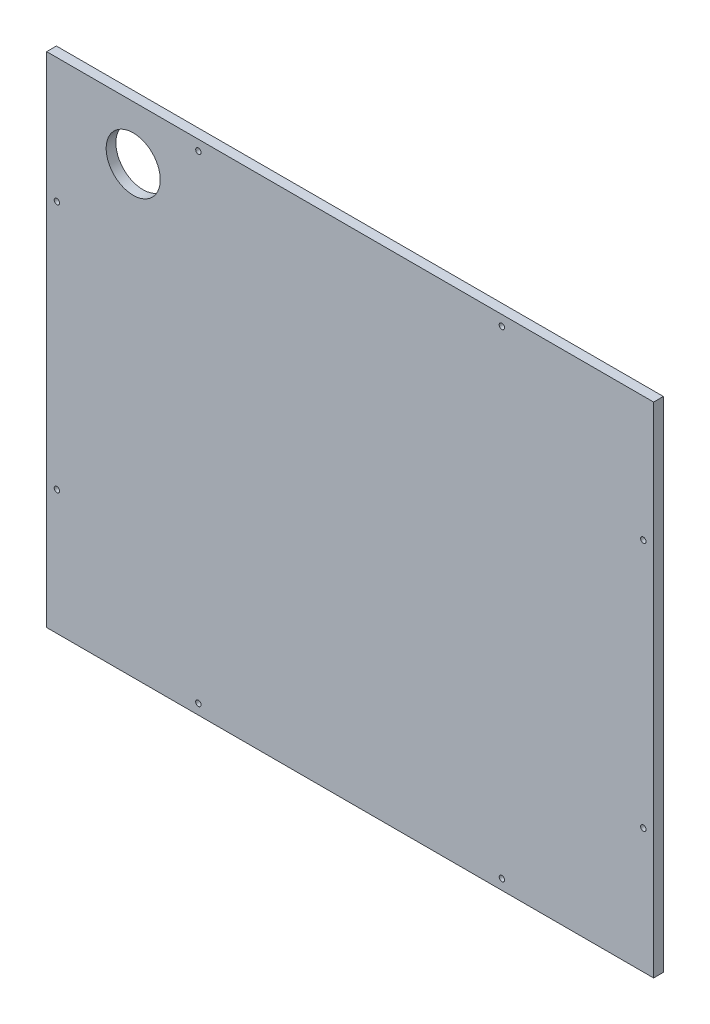
ISO-10303-21;
HEADER;
FILE_DESCRIPTION(('STEP AP214'),'2;1');
FILE_NAME('part.step','',(''),(''),'','','');
FILE_SCHEMA(('AUTOMOTIVE_DESIGN { 1 0 10303 214 1 1 1 1 }'));
ENDSEC;
DATA;
#1=APPLICATION_CONTEXT('core data for automotive mechanical design processes');
#2=APPLICATION_PROTOCOL_DEFINITION('international standard','automotive_design',2000,#1);
#3=PRODUCT_CONTEXT('',#1,'mechanical');
#4=PRODUCT('Part','Part','',(#3));
#5=PRODUCT_RELATED_PRODUCT_CATEGORY('part','',(#4));
#6=PRODUCT_DEFINITION_FORMATION('','',#4);
#7=PRODUCT_DEFINITION_CONTEXT('part definition',#1,'design');
#8=PRODUCT_DEFINITION('design','',#6,#7);
#9=PRODUCT_DEFINITION_SHAPE('','',#8);
#10=(LENGTH_UNIT() NAMED_UNIT(*) SI_UNIT(.MILLI.,.METRE.));
#11=(NAMED_UNIT(*) PLANE_ANGLE_UNIT() SI_UNIT($,.RADIAN.));
#12=(NAMED_UNIT(*) SI_UNIT($,.STERADIAN.) SOLID_ANGLE_UNIT());
#13=UNCERTAINTY_MEASURE_WITH_UNIT(LENGTH_MEASURE(1.E-05),#10,'distance_accuracy_value','');
#14=(GEOMETRIC_REPRESENTATION_CONTEXT(3) GLOBAL_UNCERTAINTY_ASSIGNED_CONTEXT((#13)) GLOBAL_UNIT_ASSIGNED_CONTEXT((#10,
#11,#12)) REPRESENTATION_CONTEXT('',''));
#15=CARTESIAN_POINT('',(0.,0.,0.));
#16=DIRECTION('',(0.,0.,1.));
#17=DIRECTION('',(1.,0.,0.));
#18=AXIS2_PLACEMENT_3D('',#15,#16,#17);
#19=CARTESIAN_POINT('',(0.,0.,9.));
#20=DIRECTION('',(0.,0.,-1.));
#21=DIRECTION('',(-1.,0.,0.));
#22=AXIS2_PLACEMENT_3D('',#19,#20,#21);
#23=PLANE('',#22);
#24=CARTESIAN_POINT('',(-200.5,411.,9.));
#25=DIRECTION('',(0.,0.,-1.));
#26=DIRECTION('',(-1.,0.,0.));
#27=AXIS2_PLACEMENT_3D('',#24,#25,#26);
#28=CIRCLE('',#27,25.);
#29=CARTESIAN_POINT('',(-225.5,411.,9.));
#30=VERTEX_POINT('',#29);
#31=EDGE_CURVE('E146',#30,#30,#28,.T.);
#32=ORIENTED_EDGE('',*,*,#31,.T.);
#33=EDGE_LOOP('',(#32));
#34=FACE_BOUND('',#33,.T.);
#35=DIRECTION('',(0.,1.,0.));
#36=VECTOR('',#35,1.);
#37=CARTESIAN_POINT('',(280.5,461.,9.));
#38=LINE('',#37,#36);
#39=CARTESIAN_POINT('',(280.5,0.,9.));
#40=VERTEX_POINT('',#39);
#41=CARTESIAN_POINT('',(280.5,461.,9.));
#42=VERTEX_POINT('',#41);
#43=EDGE_CURVE('E103',#40,#42,#38,.T.);
#44=ORIENTED_EDGE('',*,*,#43,.T.);
#45=DIRECTION('',(-1.,0.,0.));
#46=VECTOR('',#45,1.);
#47=CARTESIAN_POINT('',(280.5,461.,9.));
#48=LINE('',#47,#46);
#49=CARTESIAN_POINT('',(-280.5,461.,9.));
#50=VERTEX_POINT('',#49);
#51=EDGE_CURVE('E98',#42,#50,#48,.T.);
#52=ORIENTED_EDGE('',*,*,#51,.T.);
#53=DIRECTION('',(0.,-1.,0.));
#54=VECTOR('',#53,1.);
#55=CARTESIAN_POINT('',(-280.5,461.,9.));
#56=LINE('',#55,#54);
#57=CARTESIAN_POINT('',(-280.5,-1.0305402814825E-13,9.));
#58=VERTEX_POINT('',#57);
#59=EDGE_CURVE('E101',#50,#58,#56,.T.);
#60=ORIENTED_EDGE('',*,*,#59,.T.);
#61=DIRECTION('',(1.,0.,0.));
#62=VECTOR('',#61,1.);
#63=CARTESIAN_POINT('',(280.5,0.,9.));
#64=LINE('',#63,#62);
#65=EDGE_CURVE('E68',#58,#40,#64,.T.);
#66=ORIENTED_EDGE('',*,*,#65,.T.);
#67=EDGE_LOOP('',(#44,#52,#60,#66));
#68=FACE_BOUND('',#67,.T.);
#69=CARTESIAN_POINT('',(-140.25,451.5,9.));
#70=DIRECTION('',(0.,0.,1.));
#71=DIRECTION('',(1.,0.,0.));
#72=AXIS2_PLACEMENT_3D('',#69,#70,#71);
#73=CIRCLE('',#72,2.5);
#74=CARTESIAN_POINT('',(-137.75,451.5,9.));
#75=VERTEX_POINT('',#74);
#76=EDGE_CURVE('E131',#75,#75,#73,.T.);
#77=ORIENTED_EDGE('',*,*,#76,.F.);
#78=EDGE_LOOP('',(#77));
#79=FACE_BOUND('',#78,.T.);
#80=CARTESIAN_POINT('',(271.,345.75,9.));
#81=DIRECTION('',(0.,0.,1.));
#82=DIRECTION('',(-1.,0.,0.));
#83=AXIS2_PLACEMENT_3D('',#80,#81,#82);
#84=CIRCLE('',#83,2.50000000000002);
#85=CARTESIAN_POINT('',(268.5,345.75,9.));
#86=VERTEX_POINT('',#85);
#87=EDGE_CURVE('E141',#86,#86,#84,.T.);
#88=ORIENTED_EDGE('',*,*,#87,.F.);
#89=EDGE_LOOP('',(#88));
#90=FACE_BOUND('',#89,.T.);
#91=CARTESIAN_POINT('',(-271.,345.75,9.));
#92=DIRECTION('',(0.,0.,1.));
#93=DIRECTION('',(1.,0.,0.));
#94=AXIS2_PLACEMENT_3D('',#91,#92,#93);
#95=CIRCLE('',#94,2.50000000000002);
#96=CARTESIAN_POINT('',(-268.5,345.75,9.));
#97=VERTEX_POINT('',#96);
#98=EDGE_CURVE('E192',#97,#97,#95,.T.);
#99=ORIENTED_EDGE('',*,*,#98,.F.);
#100=EDGE_LOOP('',(#99));
#101=FACE_BOUND('',#100,.T.);
#102=CARTESIAN_POINT('',(140.25,451.5,9.));
#103=DIRECTION('',(0.,0.,1.));
#104=DIRECTION('',(-1.,0.,0.));
#105=AXIS2_PLACEMENT_3D('',#102,#103,#104);
#106=CIRCLE('',#105,2.5);
#107=CARTESIAN_POINT('',(137.75,451.5,9.));
#108=VERTEX_POINT('',#107);
#109=EDGE_CURVE('E185',#108,#108,#106,.T.);
#110=ORIENTED_EDGE('',*,*,#109,.F.);
#111=EDGE_LOOP('',(#110));
#112=FACE_BOUND('',#111,.T.);
#113=CARTESIAN_POINT('',(271.,115.25,9.));
#114=DIRECTION('',(0.,0.,1.));
#115=DIRECTION('',(1.,0.,0.));
#116=AXIS2_PLACEMENT_3D('',#113,#114,#115);
#117=CIRCLE('',#116,2.50000000000002);
#118=CARTESIAN_POINT('',(273.5,115.25,9.));
#119=VERTEX_POINT('',#118);
#120=EDGE_CURVE('E177',#119,#119,#117,.T.);
#121=ORIENTED_EDGE('',*,*,#120,.F.);
#122=EDGE_LOOP('',(#121));
#123=FACE_BOUND('',#122,.T.);
#124=CARTESIAN_POINT('',(140.25,9.50000000000001,9.));
#125=DIRECTION('',(0.,0.,1.));
#126=DIRECTION('',(1.,0.,0.));
#127=AXIS2_PLACEMENT_3D('',#124,#125,#126);
#128=CIRCLE('',#127,2.5);
#129=CARTESIAN_POINT('',(142.75,9.50000000000001,9.));
#130=VERTEX_POINT('',#129);
#131=EDGE_CURVE('E170',#130,#130,#128,.T.);
#132=ORIENTED_EDGE('',*,*,#131,.F.);
#133=EDGE_LOOP('',(#132));
#134=FACE_BOUND('',#133,.T.);
#135=CARTESIAN_POINT('',(-271.,115.25,9.));
#136=DIRECTION('',(0.,0.,1.));
#137=DIRECTION('',(-1.,0.,0.));
#138=AXIS2_PLACEMENT_3D('',#135,#136,#137);
#139=CIRCLE('',#138,2.50000000000002);
#140=CARTESIAN_POINT('',(-273.5,115.25,9.));
#141=VERTEX_POINT('',#140);
#142=EDGE_CURVE('E159',#141,#141,#139,.T.);
#143=ORIENTED_EDGE('',*,*,#142,.F.);
#144=EDGE_LOOP('',(#143));
#145=FACE_BOUND('',#144,.T.);
#146=CARTESIAN_POINT('',(-140.25,9.50000000000006,9.));
#147=DIRECTION('',(0.,0.,1.));
#148=DIRECTION('',(-1.,0.,0.));
#149=AXIS2_PLACEMENT_3D('',#146,#147,#148);
#150=CIRCLE('',#149,2.5);
#151=CARTESIAN_POINT('',(-142.75,9.50000000000006,9.));
#152=VERTEX_POINT('',#151);
#153=EDGE_CURVE('E150',#152,#152,#150,.T.);
#154=ORIENTED_EDGE('',*,*,#153,.F.);
#155=EDGE_LOOP('',(#154));
#156=FACE_BOUND('',#155,.T.);
#157=ADVANCED_FACE('F50',(#34,#68,#79,#90,#101,#112,#123,#134,#145,#156),#23,.F.);
#158=CARTESIAN_POINT('',(0.,0.,0.));
#159=DIRECTION('',(0.,0.,-1.));
#160=DIRECTION('',(-1.,0.,0.));
#161=AXIS2_PLACEMENT_3D('',#158,#159,#160);
#162=PLANE('',#161);
#163=CARTESIAN_POINT('',(-200.5,411.,0.));
#164=DIRECTION('',(0.,0.,-1.));
#165=DIRECTION('',(-1.,0.,0.));
#166=AXIS2_PLACEMENT_3D('',#163,#164,#165);
#167=CIRCLE('',#166,25.);
#168=CARTESIAN_POINT('',(-225.5,411.,0.));
#169=VERTEX_POINT('',#168);
#170=EDGE_CURVE('E54',#169,#169,#167,.T.);
#171=ORIENTED_EDGE('',*,*,#170,.F.);
#172=EDGE_LOOP('',(#171));
#173=FACE_BOUND('',#172,.T.);
#174=CARTESIAN_POINT('',(-271.,115.25,0.));
#175=DIRECTION('',(0.,0.,1.));
#176=DIRECTION('',(-1.,0.,0.));
#177=AXIS2_PLACEMENT_3D('',#174,#175,#176);
#178=CIRCLE('',#177,2.50000000000002);
#179=CARTESIAN_POINT('',(-273.5,115.25,0.));
#180=VERTEX_POINT('',#179);
#181=EDGE_CURVE('E155',#180,#180,#178,.T.);
#182=ORIENTED_EDGE('',*,*,#181,.T.);
#183=EDGE_LOOP('',(#182));
#184=FACE_BOUND('',#183,.T.);
#185=CARTESIAN_POINT('',(271.,115.25,0.));
#186=DIRECTION('',(0.,0.,1.));
#187=DIRECTION('',(1.,0.,0.));
#188=AXIS2_PLACEMENT_3D('',#185,#186,#187);
#189=CIRCLE('',#188,2.50000000000002);
#190=CARTESIAN_POINT('',(273.5,115.25,0.));
#191=VERTEX_POINT('',#190);
#192=EDGE_CURVE('E175',#191,#191,#189,.T.);
#193=ORIENTED_EDGE('',*,*,#192,.T.);
#194=EDGE_LOOP('',(#193));
#195=FACE_BOUND('',#194,.T.);
#196=CARTESIAN_POINT('',(-271.,345.75,0.));
#197=DIRECTION('',(0.,0.,1.));
#198=DIRECTION('',(1.,0.,0.));
#199=AXIS2_PLACEMENT_3D('',#196,#197,#198);
#200=CIRCLE('',#199,2.50000000000002);
#201=CARTESIAN_POINT('',(-268.5,345.75,0.));
#202=VERTEX_POINT('',#201);
#203=EDGE_CURVE('E190',#202,#202,#200,.T.);
#204=ORIENTED_EDGE('',*,*,#203,.T.);
#205=EDGE_LOOP('',(#204));
#206=FACE_BOUND('',#205,.T.);
#207=CARTESIAN_POINT('',(-140.25,451.5,0.));
#208=DIRECTION('',(0.,0.,1.));
#209=DIRECTION('',(1.,0.,0.));
#210=AXIS2_PLACEMENT_3D('',#207,#208,#209);
#211=CIRCLE('',#210,2.5);
#212=CARTESIAN_POINT('',(-137.75,451.5,0.));
#213=VERTEX_POINT('',#212);
#214=EDGE_CURVE('E138',#213,#213,#211,.T.);
#215=ORIENTED_EDGE('',*,*,#214,.T.);
#216=EDGE_LOOP('',(#215));
#217=FACE_BOUND('',#216,.T.);
#218=DIRECTION('',(0.,1.,0.));
#219=VECTOR('',#218,1.);
#220=CARTESIAN_POINT('',(280.5,461.,0.));
#221=LINE('',#220,#219);
#222=CARTESIAN_POINT('',(280.5,0.,0.));
#223=VERTEX_POINT('',#222);
#224=CARTESIAN_POINT('',(280.5,461.,0.));
#225=VERTEX_POINT('',#224);
#226=EDGE_CURVE('E137',#223,#225,#221,.T.);
#227=ORIENTED_EDGE('',*,*,#226,.F.);
#228=DIRECTION('',(1.,0.,0.));
#229=VECTOR('',#228,1.);
#230=CARTESIAN_POINT('',(280.5,0.,0.));
#231=LINE('',#230,#229);
#232=CARTESIAN_POINT('',(-280.5,-1.0305402814825E-13,0.));
#233=VERTEX_POINT('',#232);
#234=EDGE_CURVE('E91',#233,#223,#231,.T.);
#235=ORIENTED_EDGE('',*,*,#234,.F.);
#236=DIRECTION('',(0.,-1.,0.));
#237=VECTOR('',#236,1.);
#238=CARTESIAN_POINT('',(-280.5,461.,0.));
#239=LINE('',#238,#237);
#240=CARTESIAN_POINT('',(-280.5,461.,0.));
#241=VERTEX_POINT('',#240);
#242=EDGE_CURVE('E85',#241,#233,#239,.T.);
#243=ORIENTED_EDGE('',*,*,#242,.F.);
#244=DIRECTION('',(-1.,0.,0.));
#245=VECTOR('',#244,1.);
#246=CARTESIAN_POINT('',(280.5,461.,0.));
#247=LINE('',#246,#245);
#248=EDGE_CURVE('E108',#225,#241,#247,.T.);
#249=ORIENTED_EDGE('',*,*,#248,.F.);
#250=EDGE_LOOP('',(#227,#235,#243,#249));
#251=FACE_BOUND('',#250,.T.);
#252=CARTESIAN_POINT('',(271.,345.75,0.));
#253=DIRECTION('',(0.,0.,1.));
#254=DIRECTION('',(-1.,0.,0.));
#255=AXIS2_PLACEMENT_3D('',#252,#253,#254);
#256=CIRCLE('',#255,2.50000000000002);
#257=CARTESIAN_POINT('',(268.5,345.75,0.));
#258=VERTEX_POINT('',#257);
#259=EDGE_CURVE('E139',#258,#258,#256,.T.);
#260=ORIENTED_EDGE('',*,*,#259,.T.);
#261=EDGE_LOOP('',(#260));
#262=FACE_BOUND('',#261,.T.);
#263=CARTESIAN_POINT('',(140.25,451.5,0.));
#264=DIRECTION('',(0.,0.,1.));
#265=DIRECTION('',(-1.,0.,0.));
#266=AXIS2_PLACEMENT_3D('',#263,#264,#265);
#267=CIRCLE('',#266,2.5);
#268=CARTESIAN_POINT('',(137.75,451.5,0.));
#269=VERTEX_POINT('',#268);
#270=EDGE_CURVE('E182',#269,#269,#267,.T.);
#271=ORIENTED_EDGE('',*,*,#270,.T.);
#272=EDGE_LOOP('',(#271));
#273=FACE_BOUND('',#272,.T.);
#274=CARTESIAN_POINT('',(140.25,9.50000000000001,0.));
#275=DIRECTION('',(0.,0.,1.));
#276=DIRECTION('',(1.,0.,0.));
#277=AXIS2_PLACEMENT_3D('',#274,#275,#276);
#278=CIRCLE('',#277,2.5);
#279=CARTESIAN_POINT('',(142.75,9.50000000000001,0.));
#280=VERTEX_POINT('',#279);
#281=EDGE_CURVE('E164',#280,#280,#278,.T.);
#282=ORIENTED_EDGE('',*,*,#281,.T.);
#283=EDGE_LOOP('',(#282));
#284=FACE_BOUND('',#283,.T.);
#285=CARTESIAN_POINT('',(-140.25,9.50000000000006,0.));
#286=DIRECTION('',(0.,0.,1.));
#287=DIRECTION('',(-1.,0.,0.));
#288=AXIS2_PLACEMENT_3D('',#285,#286,#287);
#289=CIRCLE('',#288,2.5);
#290=CARTESIAN_POINT('',(-142.75,9.50000000000006,0.));
#291=VERTEX_POINT('',#290);
#292=EDGE_CURVE('E156',#291,#291,#289,.T.);
#293=ORIENTED_EDGE('',*,*,#292,.T.);
#294=EDGE_LOOP('',(#293));
#295=FACE_BOUND('',#294,.T.);
#296=ADVANCED_FACE('F206',(#173,#184,#195,#206,#217,#251,#262,#273,#284,#295),#162,.T.);
#297=CARTESIAN_POINT('',(280.5,461.,9.));
#298=DIRECTION('',(-1.,0.,0.));
#299=DIRECTION('',(0.,-1.,0.));
#300=AXIS2_PLACEMENT_3D('',#297,#298,#299);
#301=PLANE('',#300);
#302=ORIENTED_EDGE('',*,*,#226,.T.);
#303=DIRECTION('',(0.,0.,-1.));
#304=VECTOR('',#303,1.);
#305=CARTESIAN_POINT('',(280.5,461.,9.));
#306=LINE('',#305,#304);
#307=EDGE_CURVE('E12',#42,#225,#306,.T.);
#308=ORIENTED_EDGE('',*,*,#307,.F.);
#309=ORIENTED_EDGE('',*,*,#43,.F.);
#310=DIRECTION('',(0.,0.,-1.));
#311=VECTOR('',#310,1.);
#312=CARTESIAN_POINT('',(280.5,0.,9.));
#313=LINE('',#312,#311);
#314=EDGE_CURVE('E115',#40,#223,#313,.T.);
#315=ORIENTED_EDGE('',*,*,#314,.T.);
#316=EDGE_LOOP('',(#302,#308,#309,#315));
#317=FACE_BOUND('',#316,.T.);
#318=ADVANCED_FACE('F52',(#317),#301,.F.);
#319=CARTESIAN_POINT('',(280.5,461.,9.));
#320=DIRECTION('',(0.,-1.,0.));
#321=DIRECTION('',(1.,0.,0.));
#322=AXIS2_PLACEMENT_3D('',#319,#320,#321);
#323=PLANE('',#322);
#324=ORIENTED_EDGE('',*,*,#248,.T.);
#325=DIRECTION('',(0.,0.,-1.));
#326=VECTOR('',#325,1.);
#327=CARTESIAN_POINT('',(-280.5,461.,9.));
#328=LINE('',#327,#326);
#329=EDGE_CURVE('E60',#50,#241,#328,.T.);
#330=ORIENTED_EDGE('',*,*,#329,.F.);
#331=ORIENTED_EDGE('',*,*,#51,.F.);
#332=ORIENTED_EDGE('',*,*,#307,.T.);
#333=EDGE_LOOP('',(#324,#330,#331,#332));
#334=FACE_BOUND('',#333,.T.);
#335=ADVANCED_FACE('F107',(#334),#323,.F.);
#336=CARTESIAN_POINT('',(-280.5,461.,9.));
#337=DIRECTION('',(1.,0.,0.));
#338=DIRECTION('',(0.,1.,0.));
#339=AXIS2_PLACEMENT_3D('',#336,#337,#338);
#340=PLANE('',#339);
#341=ORIENTED_EDGE('',*,*,#242,.T.);
#342=DIRECTION('',(0.,0.,-1.));
#343=VECTOR('',#342,1.);
#344=CARTESIAN_POINT('',(-280.5,-1.0305402814825E-13,9.));
#345=LINE('',#344,#343);
#346=EDGE_CURVE('E109',#58,#233,#345,.T.);
#347=ORIENTED_EDGE('',*,*,#346,.F.);
#348=ORIENTED_EDGE('',*,*,#59,.F.);
#349=ORIENTED_EDGE('',*,*,#329,.T.);
#350=EDGE_LOOP('',(#341,#347,#348,#349));
#351=FACE_BOUND('',#350,.T.);
#352=ADVANCED_FACE('F111',(#351),#340,.F.);
#353=CARTESIAN_POINT('',(280.5,0.,9.));
#354=DIRECTION('',(0.,1.,0.));
#355=DIRECTION('',(-1.,0.,0.));
#356=AXIS2_PLACEMENT_3D('',#353,#354,#355);
#357=PLANE('',#356);
#358=ORIENTED_EDGE('',*,*,#234,.T.);
#359=ORIENTED_EDGE('',*,*,#314,.F.);
#360=ORIENTED_EDGE('',*,*,#65,.F.);
#361=ORIENTED_EDGE('',*,*,#346,.T.);
#362=EDGE_LOOP('',(#358,#359,#360,#361));
#363=FACE_BOUND('',#362,.T.);
#364=ADVANCED_FACE('F221',(#363),#357,.F.);
#365=CARTESIAN_POINT('',(-140.25,451.5,9.));
#366=DIRECTION('',(0.,0.,-1.));
#367=DIRECTION('',(-1.,0.,0.));
#368=AXIS2_PLACEMENT_3D('',#365,#366,#367);
#369=CYLINDRICAL_SURFACE('',#368,2.5);
#370=ORIENTED_EDGE('',*,*,#76,.T.);
#371=EDGE_LOOP('',(#370));
#372=FACE_BOUND('',#371,.T.);
#373=ORIENTED_EDGE('',*,*,#214,.F.);
#374=EDGE_LOOP('',(#373));
#375=FACE_BOUND('',#374,.T.);
#376=ADVANCED_FACE('F212',(#372,#375),#369,.F.);
#377=CARTESIAN_POINT('',(271.,345.75,9.));
#378=DIRECTION('',(0.,0.,-1.));
#379=DIRECTION('',(-1.,0.,0.));
#380=AXIS2_PLACEMENT_3D('',#377,#378,#379);
#381=CYLINDRICAL_SURFACE('',#380,2.50000000000002);
#382=ORIENTED_EDGE('',*,*,#87,.T.);
#383=EDGE_LOOP('',(#382));
#384=FACE_BOUND('',#383,.T.);
#385=ORIENTED_EDGE('',*,*,#259,.F.);
#386=EDGE_LOOP('',(#385));
#387=FACE_BOUND('',#386,.T.);
#388=ADVANCED_FACE('F209',(#384,#387),#381,.F.);
#389=CARTESIAN_POINT('',(-271.,345.75,9.));
#390=DIRECTION('',(0.,0.,-1.));
#391=DIRECTION('',(-1.,0.,0.));
#392=AXIS2_PLACEMENT_3D('',#389,#390,#391);
#393=CYLINDRICAL_SURFACE('',#392,2.50000000000002);
#394=ORIENTED_EDGE('',*,*,#98,.T.);
#395=EDGE_LOOP('',(#394));
#396=FACE_BOUND('',#395,.T.);
#397=ORIENTED_EDGE('',*,*,#203,.F.);
#398=EDGE_LOOP('',(#397));
#399=FACE_BOUND('',#398,.T.);
#400=ADVANCED_FACE('F211',(#396,#399),#393,.F.);
#401=CARTESIAN_POINT('',(140.25,451.5,9.));
#402=DIRECTION('',(0.,0.,-1.));
#403=DIRECTION('',(-1.,0.,0.));
#404=AXIS2_PLACEMENT_3D('',#401,#402,#403);
#405=CYLINDRICAL_SURFACE('',#404,2.5);
#406=ORIENTED_EDGE('',*,*,#109,.T.);
#407=EDGE_LOOP('',(#406));
#408=FACE_BOUND('',#407,.T.);
#409=ORIENTED_EDGE('',*,*,#270,.F.);
#410=EDGE_LOOP('',(#409));
#411=FACE_BOUND('',#410,.T.);
#412=ADVANCED_FACE('F218',(#408,#411),#405,.F.);
#413=CARTESIAN_POINT('',(271.,115.25,9.));
#414=DIRECTION('',(0.,0.,-1.));
#415=DIRECTION('',(-1.,0.,0.));
#416=AXIS2_PLACEMENT_3D('',#413,#414,#415);
#417=CYLINDRICAL_SURFACE('',#416,2.50000000000002);
#418=ORIENTED_EDGE('',*,*,#120,.T.);
#419=EDGE_LOOP('',(#418));
#420=FACE_BOUND('',#419,.T.);
#421=ORIENTED_EDGE('',*,*,#192,.F.);
#422=EDGE_LOOP('',(#421));
#423=FACE_BOUND('',#422,.T.);
#424=ADVANCED_FACE('F300',(#420,#423),#417,.F.);
#425=CARTESIAN_POINT('',(140.25,9.50000000000001,9.));
#426=DIRECTION('',(0.,0.,-1.));
#427=DIRECTION('',(-1.,0.,0.));
#428=AXIS2_PLACEMENT_3D('',#425,#426,#427);
#429=CYLINDRICAL_SURFACE('',#428,2.5);
#430=ORIENTED_EDGE('',*,*,#131,.T.);
#431=EDGE_LOOP('',(#430));
#432=FACE_BOUND('',#431,.T.);
#433=ORIENTED_EDGE('',*,*,#281,.F.);
#434=EDGE_LOOP('',(#433));
#435=FACE_BOUND('',#434,.T.);
#436=ADVANCED_FACE('F288',(#432,#435),#429,.F.);
#437=CARTESIAN_POINT('',(-271.,115.25,9.));
#438=DIRECTION('',(0.,0.,-1.));
#439=DIRECTION('',(-1.,0.,0.));
#440=AXIS2_PLACEMENT_3D('',#437,#438,#439);
#441=CYLINDRICAL_SURFACE('',#440,2.50000000000002);
#442=ORIENTED_EDGE('',*,*,#142,.T.);
#443=EDGE_LOOP('',(#442));
#444=FACE_BOUND('',#443,.T.);
#445=ORIENTED_EDGE('',*,*,#181,.F.);
#446=EDGE_LOOP('',(#445));
#447=FACE_BOUND('',#446,.T.);
#448=ADVANCED_FACE('F275',(#444,#447),#441,.F.);
#449=CARTESIAN_POINT('',(-140.25,9.50000000000006,9.));
#450=DIRECTION('',(0.,0.,-1.));
#451=DIRECTION('',(-1.,0.,0.));
#452=AXIS2_PLACEMENT_3D('',#449,#450,#451);
#453=CYLINDRICAL_SURFACE('',#452,2.5);
#454=ORIENTED_EDGE('',*,*,#153,.T.);
#455=EDGE_LOOP('',(#454));
#456=FACE_BOUND('',#455,.T.);
#457=ORIENTED_EDGE('',*,*,#292,.F.);
#458=EDGE_LOOP('',(#457));
#459=FACE_BOUND('',#458,.T.);
#460=ADVANCED_FACE('F268',(#456,#459),#453,.F.);
#461=CARTESIAN_POINT('',(-200.5,411.,9.));
#462=DIRECTION('',(0.,0.,-1.));
#463=DIRECTION('',(-1.,0.,0.));
#464=AXIS2_PLACEMENT_3D('',#461,#462,#463);
#465=CYLINDRICAL_SURFACE('',#464,25.);
#466=ORIENTED_EDGE('',*,*,#170,.T.);
#467=EDGE_LOOP('',(#466));
#468=FACE_BOUND('',#467,.T.);
#469=ORIENTED_EDGE('',*,*,#31,.F.);
#470=EDGE_LOOP('',(#469));
#471=FACE_BOUND('',#470,.T.);
#472=ADVANCED_FACE('F274',(#468,#471),#465,.F.);
#473=CLOSED_SHELL('',(#157,#296,#318,#335,#352,#364,#376,#388,#400,#412,#424,#436,#448,#460,#472));
#474=MANIFOLD_SOLID_BREP('B2',#473);
#475=ADVANCED_BREP_SHAPE_REPRESENTATION('',(#18,#474),#14);
#476=SHAPE_DEFINITION_REPRESENTATION(#9,#475);
ENDSEC;
END-ISO-10303-21;
